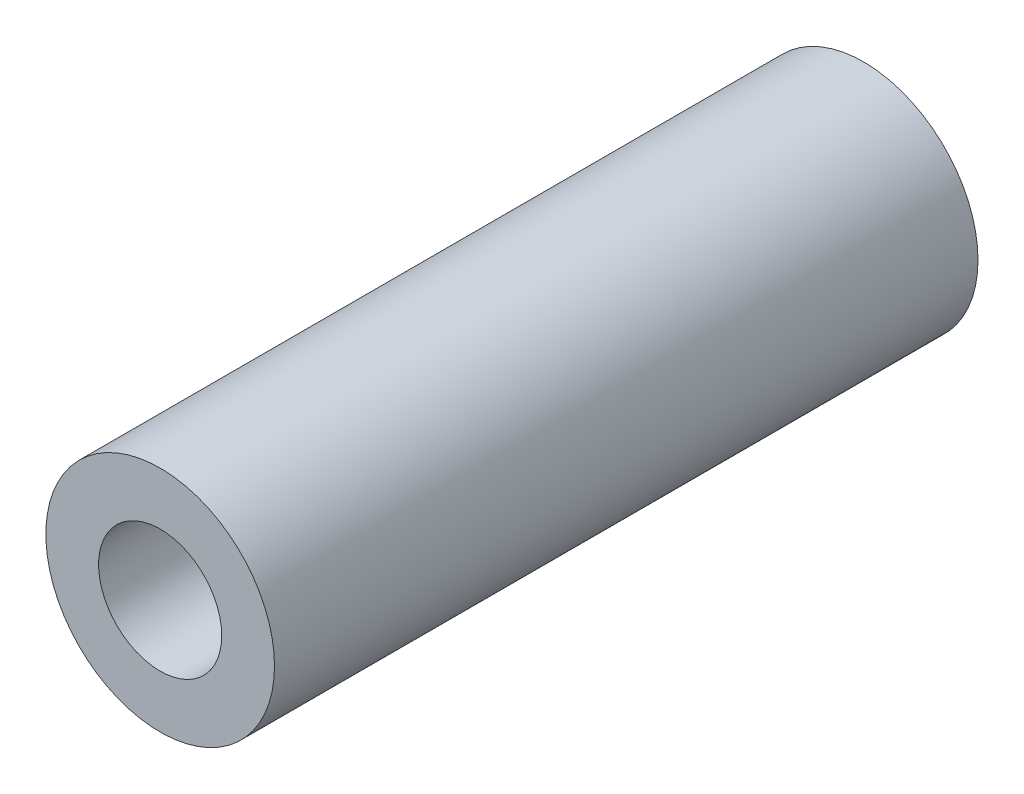
ISO-10303-21;
HEADER;
FILE_DESCRIPTION(('STEP AP214'),'2;1');
FILE_NAME('part.step','',(''),(''),'','','');
FILE_SCHEMA(('AUTOMOTIVE_DESIGN { 1 0 10303 214 1 1 1 1 }'));
ENDSEC;
DATA;
#1=APPLICATION_CONTEXT('core data for automotive mechanical design processes');
#2=APPLICATION_PROTOCOL_DEFINITION('international standard','automotive_design',2000,#1);
#3=PRODUCT_CONTEXT('',#1,'mechanical');
#4=PRODUCT('Part','Part','',(#3));
#5=PRODUCT_RELATED_PRODUCT_CATEGORY('part','',(#4));
#6=PRODUCT_DEFINITION_FORMATION('','',#4);
#7=PRODUCT_DEFINITION_CONTEXT('part definition',#1,'design');
#8=PRODUCT_DEFINITION('design','',#6,#7);
#9=PRODUCT_DEFINITION_SHAPE('','',#8);
#10=(LENGTH_UNIT() NAMED_UNIT(*) SI_UNIT(.MILLI.,.METRE.));
#11=(NAMED_UNIT(*) PLANE_ANGLE_UNIT() SI_UNIT($,.RADIAN.));
#12=(NAMED_UNIT(*) SI_UNIT($,.STERADIAN.) SOLID_ANGLE_UNIT());
#13=UNCERTAINTY_MEASURE_WITH_UNIT(LENGTH_MEASURE(1.E-05),#10,'distance_accuracy_value','');
#14=(GEOMETRIC_REPRESENTATION_CONTEXT(3) GLOBAL_UNCERTAINTY_ASSIGNED_CONTEXT((#13)) GLOBAL_UNIT_ASSIGNED_CONTEXT((#10,
#11,#12)) REPRESENTATION_CONTEXT('',''));
#15=CARTESIAN_POINT('',(0.,0.,0.));
#16=DIRECTION('',(0.,0.,1.));
#17=DIRECTION('',(1.,0.,0.));
#18=AXIS2_PLACEMENT_3D('',#15,#16,#17);
#19=CARTESIAN_POINT('',(0.,0.,20.));
#20=DIRECTION('',(0.,0.,1.));
#21=DIRECTION('',(1.,0.,0.));
#22=AXIS2_PLACEMENT_3D('',#19,#20,#21);
#23=PLANE('',#22);
#24=CARTESIAN_POINT('',(0.,0.,20.));
#25=DIRECTION('',(0.,0.,1.));
#26=DIRECTION('',(1.,0.,0.));
#27=AXIS2_PLACEMENT_3D('',#24,#25,#26);
#28=CIRCLE('',#27,3.25);
#29=CARTESIAN_POINT('',(3.25,0.,20.));
#30=VERTEX_POINT('',#29);
#31=EDGE_CURVE('E10',#30,#30,#28,.T.);
#32=ORIENTED_EDGE('',*,*,#31,.T.);
#33=EDGE_LOOP('',(#32));
#34=FACE_BOUND('',#33,.T.);
#35=CARTESIAN_POINT('',(0.,0.,20.));
#36=DIRECTION('',(0.,0.,1.));
#37=DIRECTION('',(1.,0.,0.));
#38=AXIS2_PLACEMENT_3D('',#35,#36,#37);
#39=CIRCLE('',#38,1.75);
#40=CARTESIAN_POINT('',(1.75,0.,20.));
#41=VERTEX_POINT('',#40);
#42=EDGE_CURVE('E44',#41,#41,#39,.T.);
#43=ORIENTED_EDGE('',*,*,#42,.F.);
#44=EDGE_LOOP('',(#43));
#45=FACE_BOUND('',#44,.T.);
#46=ADVANCED_FACE('F33',(#34,#45),#23,.T.);
#47=CARTESIAN_POINT('',(0.,0.,0.));
#48=DIRECTION('',(0.,0.,1.));
#49=DIRECTION('',(1.,0.,0.));
#50=AXIS2_PLACEMENT_3D('',#47,#48,#49);
#51=PLANE('',#50);
#52=CARTESIAN_POINT('',(0.,0.,0.));
#53=DIRECTION('',(0.,0.,1.));
#54=DIRECTION('',(1.,0.,0.));
#55=AXIS2_PLACEMENT_3D('',#52,#53,#54);
#56=CIRCLE('',#55,3.25);
#57=CARTESIAN_POINT('',(3.25,0.,0.));
#58=VERTEX_POINT('',#57);
#59=EDGE_CURVE('E37',#58,#58,#56,.T.);
#60=ORIENTED_EDGE('',*,*,#59,.F.);
#61=EDGE_LOOP('',(#60));
#62=FACE_BOUND('',#61,.T.);
#63=CARTESIAN_POINT('',(0.,0.,0.));
#64=DIRECTION('',(0.,0.,1.));
#65=DIRECTION('',(1.,0.,0.));
#66=AXIS2_PLACEMENT_3D('',#63,#64,#65);
#67=CIRCLE('',#66,1.75);
#68=CARTESIAN_POINT('',(1.75,0.,0.));
#69=VERTEX_POINT('',#68);
#70=EDGE_CURVE('E46',#69,#69,#67,.T.);
#71=ORIENTED_EDGE('',*,*,#70,.T.);
#72=EDGE_LOOP('',(#71));
#73=FACE_BOUND('',#72,.T.);
#74=ADVANCED_FACE('F56',(#62,#73),#51,.F.);
#75=CARTESIAN_POINT('',(0.,0.,20.));
#76=DIRECTION('',(0.,0.,-1.));
#77=DIRECTION('',(-1.,0.,0.));
#78=AXIS2_PLACEMENT_3D('',#75,#76,#77);
#79=CYLINDRICAL_SURFACE('',#78,3.25);
#80=ORIENTED_EDGE('',*,*,#31,.F.);
#81=EDGE_LOOP('',(#80));
#82=FACE_BOUND('',#81,.T.);
#83=ORIENTED_EDGE('',*,*,#59,.T.);
#84=EDGE_LOOP('',(#83));
#85=FACE_BOUND('',#84,.T.);
#86=ADVANCED_FACE('F35',(#82,#85),#79,.T.);
#87=CARTESIAN_POINT('',(0.,0.,20.));
#88=DIRECTION('',(0.,0.,-1.));
#89=DIRECTION('',(-1.,0.,0.));
#90=AXIS2_PLACEMENT_3D('',#87,#88,#89);
#91=CYLINDRICAL_SURFACE('',#90,1.75);
#92=ORIENTED_EDGE('',*,*,#42,.T.);
#93=EDGE_LOOP('',(#92));
#94=FACE_BOUND('',#93,.T.);
#95=ORIENTED_EDGE('',*,*,#70,.F.);
#96=EDGE_LOOP('',(#95));
#97=FACE_BOUND('',#96,.T.);
#98=ADVANCED_FACE('F52',(#94,#97),#91,.F.);
#99=CLOSED_SHELL('',(#46,#74,#86,#98));
#100=MANIFOLD_SOLID_BREP('B2',#99);
#101=ADVANCED_BREP_SHAPE_REPRESENTATION('',(#18,#100),#14);
#102=SHAPE_DEFINITION_REPRESENTATION(#9,#101);
ENDSEC;
END-ISO-10303-21;
